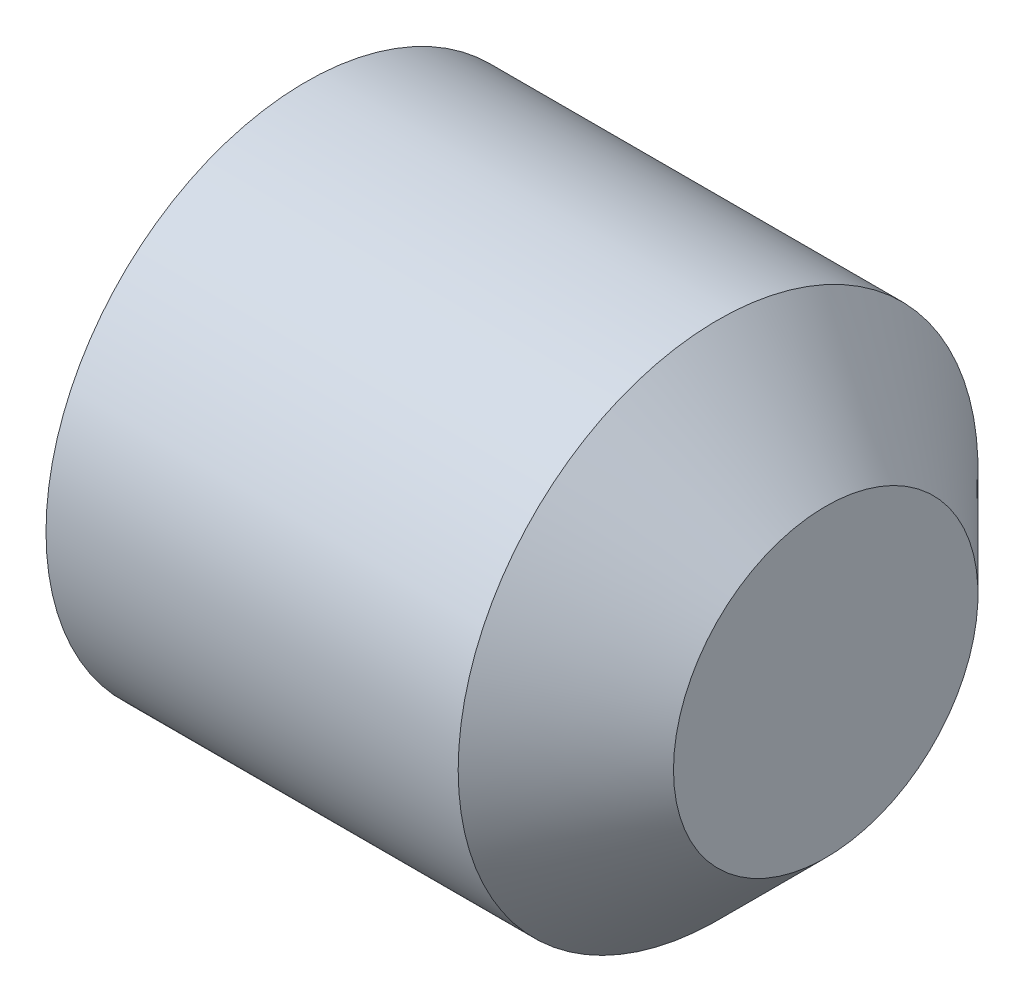
ISO-10303-21;
HEADER;
FILE_DESCRIPTION(('STEP AP214'),'2;1');
FILE_NAME('part.step','',(''),(''),'','','');
FILE_SCHEMA(('AUTOMOTIVE_DESIGN { 1 0 10303 214 1 1 1 1 }'));
ENDSEC;
DATA;
#1=APPLICATION_CONTEXT('core data for automotive mechanical design processes');
#2=APPLICATION_PROTOCOL_DEFINITION('international standard','automotive_design',2000,#1);
#3=PRODUCT_CONTEXT('',#1,'mechanical');
#4=PRODUCT('Part','Part','',(#3));
#5=PRODUCT_RELATED_PRODUCT_CATEGORY('part','',(#4));
#6=PRODUCT_DEFINITION_FORMATION('','',#4);
#7=PRODUCT_DEFINITION_CONTEXT('part definition',#1,'design');
#8=PRODUCT_DEFINITION('design','',#6,#7);
#9=PRODUCT_DEFINITION_SHAPE('','',#8);
#10=(LENGTH_UNIT() NAMED_UNIT(*) SI_UNIT(.MILLI.,.METRE.));
#11=(NAMED_UNIT(*) PLANE_ANGLE_UNIT() SI_UNIT($,.RADIAN.));
#12=(NAMED_UNIT(*) SI_UNIT($,.STERADIAN.) SOLID_ANGLE_UNIT());
#13=UNCERTAINTY_MEASURE_WITH_UNIT(LENGTH_MEASURE(1.E-05),#10,'distance_accuracy_value','');
#14=(GEOMETRIC_REPRESENTATION_CONTEXT(3) GLOBAL_UNCERTAINTY_ASSIGNED_CONTEXT((#13)) GLOBAL_UNIT_ASSIGNED_CONTEXT((#10,
#11,#12)) REPRESENTATION_CONTEXT('',''));
#15=CARTESIAN_POINT('',(0.,0.,0.));
#16=DIRECTION('',(0.,0.,1.));
#17=DIRECTION('',(1.,0.,0.));
#18=AXIS2_PLACEMENT_3D('',#15,#16,#17);
#19=CARTESIAN_POINT('',(0.,3.,0.));
#20=DIRECTION('',(1.,0.,0.));
#21=DIRECTION('',(0.,0.,-1.));
#22=AXIS2_PLACEMENT_3D('',#19,#20,#21);
#23=PLANE('',#22);
#24=DIRECTION('',(0.,-0.866025403784438,-0.5));
#25=VECTOR('',#24,1.);
#26=CARTESIAN_POINT('',(0.,1.5,-0.866025403784438));
#27=LINE('',#26,#25);
#28=CARTESIAN_POINT('',(0.,1.5,-0.866025403784439));
#29=VERTEX_POINT('',#28);
#30=CARTESIAN_POINT('',(0.,0.,-1.73205080756888));
#31=VERTEX_POINT('',#30);
#32=EDGE_CURVE('E122',#29,#31,#27,.T.);
#33=ORIENTED_EDGE('',*,*,#32,.F.);
#34=DIRECTION('',(0.,0.,-1.));
#35=VECTOR('',#34,1.);
#36=CARTESIAN_POINT('',(0.,1.5,0.866025403784439));
#37=LINE('',#36,#35);
#38=CARTESIAN_POINT('',(0.,1.5,0.866025403784439));
#39=VERTEX_POINT('',#38);
#40=EDGE_CURVE('E48',#39,#29,#37,.T.);
#41=ORIENTED_EDGE('',*,*,#40,.F.);
#42=DIRECTION('',(0.,0.866025403784439,-0.5));
#43=VECTOR('',#42,1.);
#44=CARTESIAN_POINT('',(0.,0.,1.73205080756888));
#45=LINE('',#44,#43);
#46=CARTESIAN_POINT('',(0.,0.,1.73205080756888));
#47=VERTEX_POINT('',#46);
#48=EDGE_CURVE('E131',#47,#39,#45,.T.);
#49=ORIENTED_EDGE('',*,*,#48,.F.);
#50=DIRECTION('',(0.,0.866025403784439,0.5));
#51=VECTOR('',#50,1.);
#52=CARTESIAN_POINT('',(0.,-1.5,0.866025403784438));
#53=LINE('',#52,#51);
#54=CARTESIAN_POINT('',(0.,-1.5,0.866025403784438));
#55=VERTEX_POINT('',#54);
#56=EDGE_CURVE('E129',#55,#47,#53,.T.);
#57=ORIENTED_EDGE('',*,*,#56,.F.);
#58=DIRECTION('',(0.,0.,1.));
#59=VECTOR('',#58,1.);
#60=CARTESIAN_POINT('',(0.,-1.5,-0.866025403784439));
#61=LINE('',#60,#59);
#62=CARTESIAN_POINT('',(0.,-1.5,-0.866025403784439));
#63=VERTEX_POINT('',#62);
#64=EDGE_CURVE('E96',#63,#55,#61,.T.);
#65=ORIENTED_EDGE('',*,*,#64,.F.);
#66=DIRECTION('',(0.,-0.866025403784439,0.5));
#67=VECTOR('',#66,1.);
#68=CARTESIAN_POINT('',(0.,0.,-1.73205080756888));
#69=LINE('',#68,#67);
#70=EDGE_CURVE('E125',#31,#63,#69,.T.);
#71=ORIENTED_EDGE('',*,*,#70,.F.);
#72=EDGE_LOOP('',(#33,#41,#49,#57,#65,#71));
#73=FACE_BOUND('',#72,.T.);
#74=CARTESIAN_POINT('',(0.,0.,0.));
#75=DIRECTION('',(-1.,0.,0.));
#76=DIRECTION('',(0.,0.,1.));
#77=AXIS2_PLACEMENT_3D('',#74,#75,#76);
#78=CIRCLE('',#77,3.);
#79=CARTESIAN_POINT('',(0.,0.,3.));
#80=VERTEX_POINT('',#79);
#81=EDGE_CURVE('E11',#80,#80,#78,.T.);
#82=ORIENTED_EDGE('',*,*,#81,.T.);
#83=EDGE_LOOP('',(#82));
#84=FACE_BOUND('',#83,.T.);
#85=ADVANCED_FACE('F34',(#73,#84),#23,.F.);
#86=CARTESIAN_POINT('',(0.,0.,0.));
#87=DIRECTION('',(-1.,0.,0.));
#88=DIRECTION('',(0.,0.,1.));
#89=AXIS2_PLACEMENT_3D('',#86,#87,#88);
#90=CYLINDRICAL_SURFACE('',#89,3.);
#91=ORIENTED_EDGE('',*,*,#81,.F.);
#92=EDGE_LOOP('',(#91));
#93=FACE_BOUND('',#92,.T.);
#94=CARTESIAN_POINT('',(4.75735931288072,0.,0.));
#95=DIRECTION('',(-1.,0.,0.));
#96=DIRECTION('',(0.,0.,1.));
#97=AXIS2_PLACEMENT_3D('',#94,#95,#96);
#98=CIRCLE('',#97,3.);
#99=CARTESIAN_POINT('',(4.75735931288072,0.,3.));
#100=VERTEX_POINT('',#99);
#101=EDGE_CURVE('E41',#100,#100,#98,.T.);
#102=ORIENTED_EDGE('',*,*,#101,.T.);
#103=EDGE_LOOP('',(#102));
#104=FACE_BOUND('',#103,.T.);
#105=ADVANCED_FACE('F145',(#93,#104),#90,.T.);
#106=CARTESIAN_POINT('',(6.,0.,0.));
#107=DIRECTION('',(-1.,0.,0.));
#108=DIRECTION('',(0.,0.,1.));
#109=AXIS2_PLACEMENT_3D('',#106,#107,#108);
#110=CONICAL_SURFACE('',#109,1.75735931288071,0.785398163397449);
#111=ORIENTED_EDGE('',*,*,#101,.F.);
#112=EDGE_LOOP('',(#111));
#113=FACE_BOUND('',#112,.T.);
#114=CARTESIAN_POINT('',(6.,0.,0.));
#115=DIRECTION('',(-1.,0.,0.));
#116=DIRECTION('',(0.,0.,1.));
#117=AXIS2_PLACEMENT_3D('',#114,#115,#116);
#118=CIRCLE('',#117,1.75735931288071);
#119=CARTESIAN_POINT('',(6.,0.,1.75735931288071));
#120=VERTEX_POINT('',#119);
#121=EDGE_CURVE('E135',#120,#120,#118,.T.);
#122=ORIENTED_EDGE('',*,*,#121,.T.);
#123=EDGE_LOOP('',(#122));
#124=FACE_BOUND('',#123,.T.);
#125=ADVANCED_FACE('F147',(#113,#124),#110,.T.);
#126=CARTESIAN_POINT('',(6.,1.75735931288071,0.));
#127=DIRECTION('',(-1.,0.,0.));
#128=DIRECTION('',(0.,0.,1.));
#129=AXIS2_PLACEMENT_3D('',#126,#127,#128);
#130=PLANE('',#129);
#131=ORIENTED_EDGE('',*,*,#121,.F.);
#132=EDGE_LOOP('',(#131));
#133=FACE_BOUND('',#132,.T.);
#134=ADVANCED_FACE('F150',(#133),#130,.F.);
#135=CARTESIAN_POINT('',(2.,1.5,0.866025403784439));
#136=DIRECTION('',(0.,1.,0.));
#137=DIRECTION('',(0.,0.,1.));
#138=AXIS2_PLACEMENT_3D('',#135,#136,#137);
#139=PLANE('',#138);
#140=ORIENTED_EDGE('',*,*,#40,.T.);
#141=DIRECTION('',(-1.,0.,0.));
#142=VECTOR('',#141,1.);
#143=CARTESIAN_POINT('',(2.,1.5,-0.866025403784438));
#144=LINE('',#143,#142);
#145=CARTESIAN_POINT('',(2.,1.5,-0.866025403784438));
#146=VERTEX_POINT('',#145);
#147=EDGE_CURVE('E78',#146,#29,#144,.T.);
#148=ORIENTED_EDGE('',*,*,#147,.F.);
#149=DIRECTION('',(0.,0.,-1.));
#150=VECTOR('',#149,1.);
#151=CARTESIAN_POINT('',(2.,1.5,0.866025403784439));
#152=LINE('',#151,#150);
#153=CARTESIAN_POINT('',(2.,1.5,0.866025403784439));
#154=VERTEX_POINT('',#153);
#155=EDGE_CURVE('E133',#154,#146,#152,.T.);
#156=ORIENTED_EDGE('',*,*,#155,.F.);
#157=DIRECTION('',(-1.,0.,0.));
#158=VECTOR('',#157,1.);
#159=CARTESIAN_POINT('',(2.,1.5,0.866025403784439));
#160=LINE('',#159,#158);
#161=EDGE_CURVE('E56',#154,#39,#160,.T.);
#162=ORIENTED_EDGE('',*,*,#161,.T.);
#163=EDGE_LOOP('',(#140,#148,#156,#162));
#164=FACE_BOUND('',#163,.T.);
#165=ADVANCED_FACE('F155',(#164),#139,.F.);
#166=CARTESIAN_POINT('',(2.,0.,1.73205080756888));
#167=DIRECTION('',(0.,0.5,0.866025403784439));
#168=DIRECTION('',(0.,-0.866025403784439,0.5));
#169=AXIS2_PLACEMENT_3D('',#166,#167,#168);
#170=PLANE('',#169);
#171=ORIENTED_EDGE('',*,*,#48,.T.);
#172=ORIENTED_EDGE('',*,*,#161,.F.);
#173=DIRECTION('',(0.,0.866025403784439,-0.5));
#174=VECTOR('',#173,1.);
#175=CARTESIAN_POINT('',(2.,0.,1.73205080756888));
#176=LINE('',#175,#174);
#177=CARTESIAN_POINT('',(2.,0.,1.73205080756888));
#178=VERTEX_POINT('',#177);
#179=EDGE_CURVE('E108',#178,#154,#176,.T.);
#180=ORIENTED_EDGE('',*,*,#179,.F.);
#181=DIRECTION('',(-1.,0.,0.));
#182=VECTOR('',#181,1.);
#183=CARTESIAN_POINT('',(2.,0.,1.73205080756888));
#184=LINE('',#183,#182);
#185=EDGE_CURVE('E100',#178,#47,#184,.T.);
#186=ORIENTED_EDGE('',*,*,#185,.T.);
#187=EDGE_LOOP('',(#171,#172,#180,#186));
#188=FACE_BOUND('',#187,.T.);
#189=ADVANCED_FACE('F160',(#188),#170,.F.);
#190=CARTESIAN_POINT('',(2.,-1.5,0.866025403784438));
#191=DIRECTION('',(0.,-0.5,0.866025403784439));
#192=DIRECTION('',(0.,-0.866025403784439,-0.5));
#193=AXIS2_PLACEMENT_3D('',#190,#191,#192);
#194=PLANE('',#193);
#195=ORIENTED_EDGE('',*,*,#56,.T.);
#196=ORIENTED_EDGE('',*,*,#185,.F.);
#197=DIRECTION('',(0.,0.866025403784439,0.5));
#198=VECTOR('',#197,1.);
#199=CARTESIAN_POINT('',(2.,-1.5,0.866025403784438));
#200=LINE('',#199,#198);
#201=CARTESIAN_POINT('',(2.,-1.5,0.866025403784438));
#202=VERTEX_POINT('',#201);
#203=EDGE_CURVE('E104',#202,#178,#200,.T.);
#204=ORIENTED_EDGE('',*,*,#203,.F.);
#205=DIRECTION('',(-1.,0.,0.));
#206=VECTOR('',#205,1.);
#207=CARTESIAN_POINT('',(2.,-1.5,0.866025403784438));
#208=LINE('',#207,#206);
#209=EDGE_CURVE('E89',#202,#55,#208,.T.);
#210=ORIENTED_EDGE('',*,*,#209,.T.);
#211=EDGE_LOOP('',(#195,#196,#204,#210));
#212=FACE_BOUND('',#211,.T.);
#213=ADVANCED_FACE('F105',(#212),#194,.F.);
#214=CARTESIAN_POINT('',(2.,-1.5,-0.866025403784439));
#215=DIRECTION('',(0.,-1.,0.));
#216=DIRECTION('',(0.,0.,-1.));
#217=AXIS2_PLACEMENT_3D('',#214,#215,#216);
#218=PLANE('',#217);
#219=ORIENTED_EDGE('',*,*,#64,.T.);
#220=ORIENTED_EDGE('',*,*,#209,.F.);
#221=DIRECTION('',(0.,0.,1.));
#222=VECTOR('',#221,1.);
#223=CARTESIAN_POINT('',(2.,-1.5,-0.866025403784439));
#224=LINE('',#223,#222);
#225=CARTESIAN_POINT('',(2.,-1.5,-0.866025403784439));
#226=VERTEX_POINT('',#225);
#227=EDGE_CURVE('E93',#226,#202,#224,.T.);
#228=ORIENTED_EDGE('',*,*,#227,.F.);
#229=DIRECTION('',(-1.,0.,0.));
#230=VECTOR('',#229,1.);
#231=CARTESIAN_POINT('',(2.,-1.5,-0.866025403784439));
#232=LINE('',#231,#230);
#233=EDGE_CURVE('E101',#226,#63,#232,.T.);
#234=ORIENTED_EDGE('',*,*,#233,.T.);
#235=EDGE_LOOP('',(#219,#220,#228,#234));
#236=FACE_BOUND('',#235,.T.);
#237=ADVANCED_FACE('F91',(#236),#218,.F.);
#238=CARTESIAN_POINT('',(2.,0.,-1.73205080756888));
#239=DIRECTION('',(0.,-0.5,-0.866025403784439));
#240=DIRECTION('',(0.,0.866025403784439,-0.5));
#241=AXIS2_PLACEMENT_3D('',#238,#239,#240);
#242=PLANE('',#241);
#243=ORIENTED_EDGE('',*,*,#70,.T.);
#244=ORIENTED_EDGE('',*,*,#233,.F.);
#245=DIRECTION('',(0.,-0.866025403784439,0.5));
#246=VECTOR('',#245,1.);
#247=CARTESIAN_POINT('',(2.,0.,-1.73205080756888));
#248=LINE('',#247,#246);
#249=CARTESIAN_POINT('',(2.,0.,-1.73205080756888));
#250=VERTEX_POINT('',#249);
#251=EDGE_CURVE('E114',#250,#226,#248,.T.);
#252=ORIENTED_EDGE('',*,*,#251,.F.);
#253=DIRECTION('',(-1.,0.,0.));
#254=VECTOR('',#253,1.);
#255=CARTESIAN_POINT('',(2.,0.,-1.73205080756888));
#256=LINE('',#255,#254);
#257=EDGE_CURVE('E138',#250,#31,#256,.T.);
#258=ORIENTED_EDGE('',*,*,#257,.T.);
#259=EDGE_LOOP('',(#243,#244,#252,#258));
#260=FACE_BOUND('',#259,.T.);
#261=ADVANCED_FACE('F186',(#260),#242,.F.);
#262=CARTESIAN_POINT('',(2.,1.5,-0.866025403784438));
#263=DIRECTION('',(0.,0.5,-0.866025403784439));
#264=DIRECTION('',(0.,0.866025403784438,0.5));
#265=AXIS2_PLACEMENT_3D('',#262,#263,#264);
#266=PLANE('',#265);
#267=ORIENTED_EDGE('',*,*,#32,.T.);
#268=ORIENTED_EDGE('',*,*,#257,.F.);
#269=DIRECTION('',(0.,-0.866025403784438,-0.5));
#270=VECTOR('',#269,1.);
#271=CARTESIAN_POINT('',(2.,1.5,-0.866025403784438));
#272=LINE('',#271,#270);
#273=EDGE_CURVE('E116',#146,#250,#272,.T.);
#274=ORIENTED_EDGE('',*,*,#273,.F.);
#275=ORIENTED_EDGE('',*,*,#147,.T.);
#276=EDGE_LOOP('',(#267,#268,#274,#275));
#277=FACE_BOUND('',#276,.T.);
#278=ADVANCED_FACE('F174',(#277),#266,.F.);
#279=CARTESIAN_POINT('',(2.,1.5,-2.59807621135332));
#280=DIRECTION('',(-1.,0.,0.));
#281=DIRECTION('',(0.,0.,1.));
#282=AXIS2_PLACEMENT_3D('',#279,#280,#281);
#283=PLANE('',#282);
#284=ORIENTED_EDGE('',*,*,#155,.T.);
#285=ORIENTED_EDGE('',*,*,#273,.T.);
#286=ORIENTED_EDGE('',*,*,#251,.T.);
#287=ORIENTED_EDGE('',*,*,#227,.T.);
#288=ORIENTED_EDGE('',*,*,#203,.T.);
#289=ORIENTED_EDGE('',*,*,#179,.T.);
#290=EDGE_LOOP('',(#284,#285,#286,#287,#288,#289));
#291=FACE_BOUND('',#290,.T.);
#292=ADVANCED_FACE('F111',(#291),#283,.T.);
#293=CLOSED_SHELL('',(#85,#105,#125,#134,#165,#189,#213,#237,#261,#278,#292));
#294=MANIFOLD_SOLID_BREP('B2',#293);
#295=ADVANCED_BREP_SHAPE_REPRESENTATION('',(#18,#294),#14);
#296=SHAPE_DEFINITION_REPRESENTATION(#9,#295);
ENDSEC;
END-ISO-10303-21;
